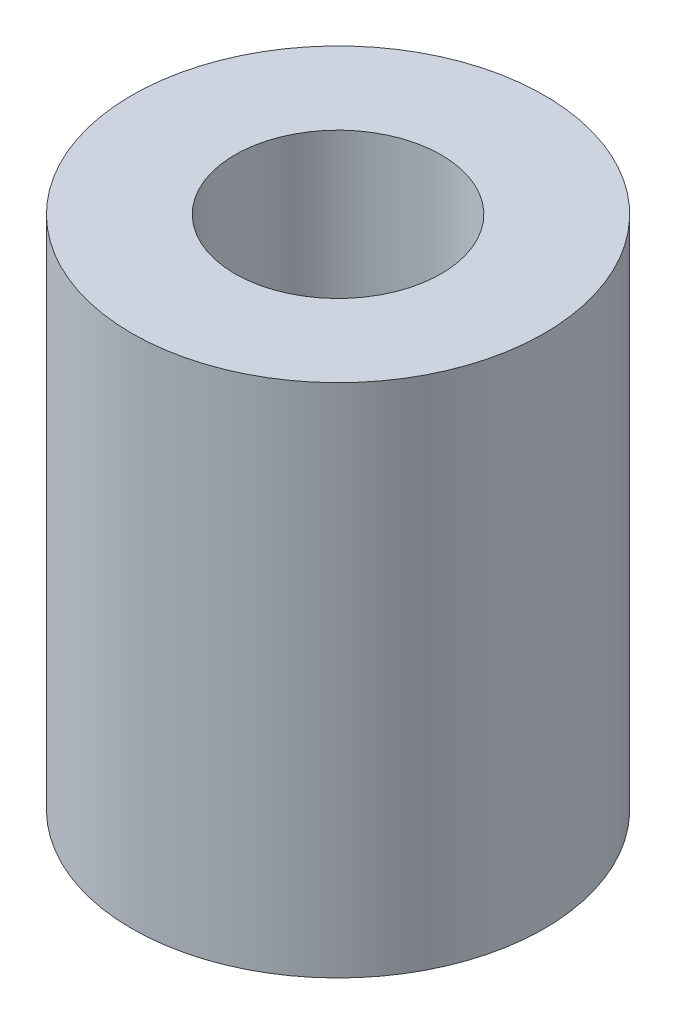
ISO-10303-21;
HEADER;
FILE_DESCRIPTION(('STEP AP214'),'2;1');
FILE_NAME('part.step','',(''),(''),'','','');
FILE_SCHEMA(('AUTOMOTIVE_DESIGN { 1 0 10303 214 1 1 1 1 }'));
ENDSEC;
DATA;
#1=APPLICATION_CONTEXT('core data for automotive mechanical design processes');
#2=APPLICATION_PROTOCOL_DEFINITION('international standard','automotive_design',2000,#1);
#3=PRODUCT_CONTEXT('',#1,'mechanical');
#4=PRODUCT('Part','Part','',(#3));
#5=PRODUCT_RELATED_PRODUCT_CATEGORY('part','',(#4));
#6=PRODUCT_DEFINITION_FORMATION('','',#4);
#7=PRODUCT_DEFINITION_CONTEXT('part definition',#1,'design');
#8=PRODUCT_DEFINITION('design','',#6,#7);
#9=PRODUCT_DEFINITION_SHAPE('','',#8);
#10=(LENGTH_UNIT() NAMED_UNIT(*) SI_UNIT(.MILLI.,.METRE.));
#11=(NAMED_UNIT(*) PLANE_ANGLE_UNIT() SI_UNIT($,.RADIAN.));
#12=(NAMED_UNIT(*) SI_UNIT($,.STERADIAN.) SOLID_ANGLE_UNIT());
#13=UNCERTAINTY_MEASURE_WITH_UNIT(LENGTH_MEASURE(1.E-05),#10,'distance_accuracy_value','');
#14=(GEOMETRIC_REPRESENTATION_CONTEXT(3) GLOBAL_UNCERTAINTY_ASSIGNED_CONTEXT((#13)) GLOBAL_UNIT_ASSIGNED_CONTEXT((#10,
#11,#12)) REPRESENTATION_CONTEXT('',''));
#15=CARTESIAN_POINT('',(0.,0.,0.));
#16=DIRECTION('',(0.,0.,1.));
#17=DIRECTION('',(1.,0.,0.));
#18=AXIS2_PLACEMENT_3D('',#15,#16,#17);
#19=CARTESIAN_POINT('',(0.,50.,0.));
#20=DIRECTION('',(0.,1.,0.));
#21=DIRECTION('',(0.,0.,1.));
#22=AXIS2_PLACEMENT_3D('',#19,#20,#21);
#23=PLANE('',#22);
#24=CARTESIAN_POINT('',(0.,50.,0.));
#25=DIRECTION('',(0.,1.,0.));
#26=DIRECTION('',(0.,0.,1.));
#27=AXIS2_PLACEMENT_3D('',#24,#25,#26);
#28=CIRCLE('',#27,20.);
#29=CARTESIAN_POINT('',(0.,50.,20.));
#30=VERTEX_POINT('',#29);
#31=EDGE_CURVE('E11',#30,#30,#28,.T.);
#32=ORIENTED_EDGE('',*,*,#31,.T.);
#33=EDGE_LOOP('',(#32));
#34=FACE_BOUND('',#33,.T.);
#35=CARTESIAN_POINT('',(0.,50.,0.));
#36=DIRECTION('',(0.,1.,0.));
#37=DIRECTION('',(0.,0.,1.));
#38=AXIS2_PLACEMENT_3D('',#35,#36,#37);
#39=CIRCLE('',#38,10.);
#40=CARTESIAN_POINT('',(0.,50.,10.));
#41=VERTEX_POINT('',#40);
#42=EDGE_CURVE('E48',#41,#41,#39,.T.);
#43=ORIENTED_EDGE('',*,*,#42,.F.);
#44=EDGE_LOOP('',(#43));
#45=FACE_BOUND('',#44,.T.);
#46=ADVANCED_FACE('F37',(#34,#45),#23,.T.);
#47=CARTESIAN_POINT('',(0.,0.,0.));
#48=DIRECTION('',(0.,1.,0.));
#49=DIRECTION('',(0.,0.,1.));
#50=AXIS2_PLACEMENT_3D('',#47,#48,#49);
#51=PLANE('',#50);
#52=CARTESIAN_POINT('',(0.,0.,0.));
#53=DIRECTION('',(0.,1.,0.));
#54=DIRECTION('',(0.,0.,1.));
#55=AXIS2_PLACEMENT_3D('',#52,#53,#54);
#56=CIRCLE('',#55,20.);
#57=CARTESIAN_POINT('',(0.,0.,20.));
#58=VERTEX_POINT('',#57);
#59=EDGE_CURVE('E41',#58,#58,#56,.T.);
#60=ORIENTED_EDGE('',*,*,#59,.F.);
#61=EDGE_LOOP('',(#60));
#62=FACE_BOUND('',#61,.T.);
#63=CARTESIAN_POINT('',(0.,0.,0.));
#64=DIRECTION('',(0.,1.,0.));
#65=DIRECTION('',(0.,0.,1.));
#66=AXIS2_PLACEMENT_3D('',#63,#64,#65);
#67=CIRCLE('',#66,10.);
#68=CARTESIAN_POINT('',(0.,0.,10.));
#69=VERTEX_POINT('',#68);
#70=EDGE_CURVE('E50',#69,#69,#67,.T.);
#71=ORIENTED_EDGE('',*,*,#70,.T.);
#72=EDGE_LOOP('',(#71));
#73=FACE_BOUND('',#72,.T.);
#74=ADVANCED_FACE('F60',(#62,#73),#51,.F.);
#75=CARTESIAN_POINT('',(0.,50.,0.));
#76=DIRECTION('',(0.,-1.,0.));
#77=DIRECTION('',(0.,0.,-1.));
#78=AXIS2_PLACEMENT_3D('',#75,#76,#77);
#79=CYLINDRICAL_SURFACE('',#78,20.);
#80=ORIENTED_EDGE('',*,*,#31,.F.);
#81=EDGE_LOOP('',(#80));
#82=FACE_BOUND('',#81,.T.);
#83=ORIENTED_EDGE('',*,*,#59,.T.);
#84=EDGE_LOOP('',(#83));
#85=FACE_BOUND('',#84,.T.);
#86=ADVANCED_FACE('F39',(#82,#85),#79,.T.);
#87=CARTESIAN_POINT('',(0.,50.,0.));
#88=DIRECTION('',(0.,-1.,0.));
#89=DIRECTION('',(0.,0.,-1.));
#90=AXIS2_PLACEMENT_3D('',#87,#88,#89);
#91=CYLINDRICAL_SURFACE('',#90,10.);
#92=ORIENTED_EDGE('',*,*,#42,.T.);
#93=EDGE_LOOP('',(#92));
#94=FACE_BOUND('',#93,.T.);
#95=ORIENTED_EDGE('',*,*,#70,.F.);
#96=EDGE_LOOP('',(#95));
#97=FACE_BOUND('',#96,.T.);
#98=ADVANCED_FACE('F56',(#94,#97),#91,.F.);
#99=CLOSED_SHELL('',(#46,#74,#86,#98));
#100=MANIFOLD_SOLID_BREP('B2',#99);
#101=ADVANCED_BREP_SHAPE_REPRESENTATION('',(#18,#100),#14);
#102=SHAPE_DEFINITION_REPRESENTATION(#9,#101);
ENDSEC;
END-ISO-10303-21;
